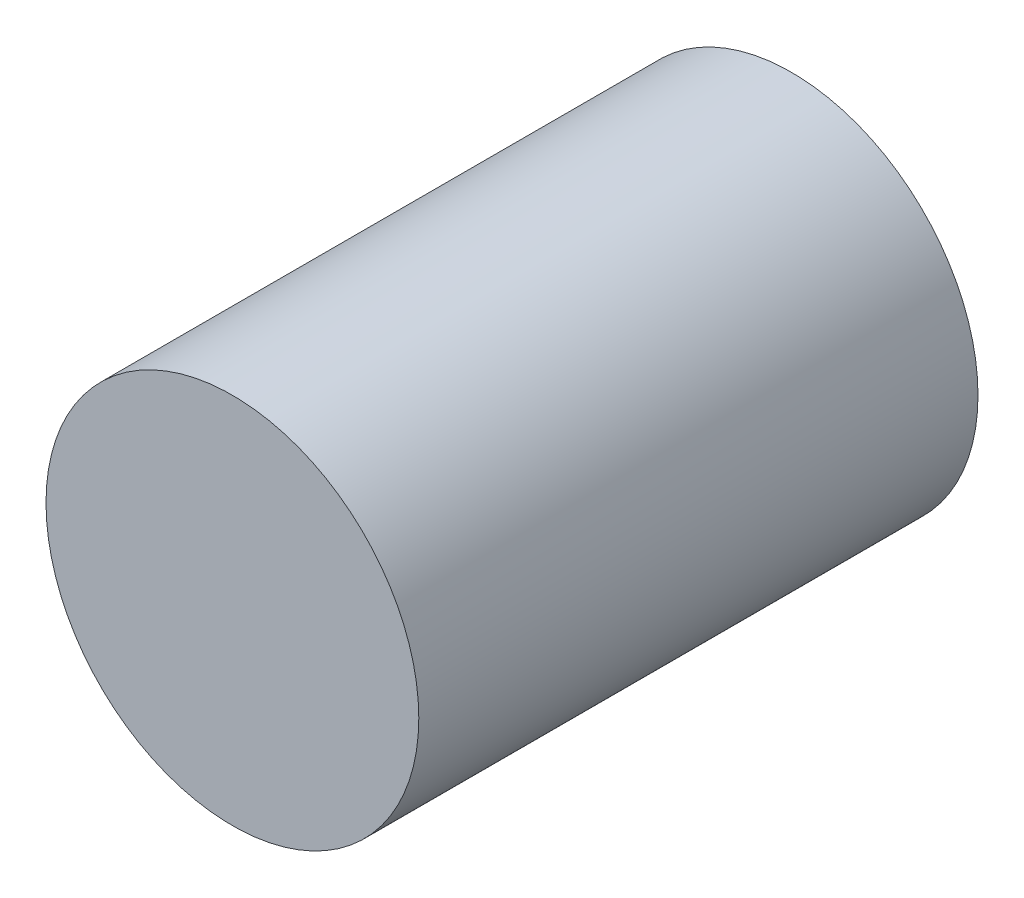
ISO-10303-21;
HEADER;
FILE_DESCRIPTION(('STEP AP214'),'2;1');
FILE_NAME('part.step','',(''),(''),'','','');
FILE_SCHEMA(('AUTOMOTIVE_DESIGN { 1 0 10303 214 1 1 1 1 }'));
ENDSEC;
DATA;
#1=APPLICATION_CONTEXT('core data for automotive mechanical design processes');
#2=APPLICATION_PROTOCOL_DEFINITION('international standard','automotive_design',2000,#1);
#3=PRODUCT_CONTEXT('',#1,'mechanical');
#4=PRODUCT('Part','Part','',(#3));
#5=PRODUCT_RELATED_PRODUCT_CATEGORY('part','',(#4));
#6=PRODUCT_DEFINITION_FORMATION('','',#4);
#7=PRODUCT_DEFINITION_CONTEXT('part definition',#1,'design');
#8=PRODUCT_DEFINITION('design','',#6,#7);
#9=PRODUCT_DEFINITION_SHAPE('','',#8);
#10=(LENGTH_UNIT() NAMED_UNIT(*) SI_UNIT(.MILLI.,.METRE.));
#11=(NAMED_UNIT(*) PLANE_ANGLE_UNIT() SI_UNIT($,.RADIAN.));
#12=(NAMED_UNIT(*) SI_UNIT($,.STERADIAN.) SOLID_ANGLE_UNIT());
#13=UNCERTAINTY_MEASURE_WITH_UNIT(LENGTH_MEASURE(1.E-05),#10,'distance_accuracy_value','');
#14=(GEOMETRIC_REPRESENTATION_CONTEXT(3) GLOBAL_UNCERTAINTY_ASSIGNED_CONTEXT((#13)) GLOBAL_UNIT_ASSIGNED_CONTEXT((#10,
#11,#12)) REPRESENTATION_CONTEXT('',''));
#15=CARTESIAN_POINT('',(0.,0.,0.));
#16=DIRECTION('',(0.,0.,1.));
#17=DIRECTION('',(1.,0.,0.));
#18=AXIS2_PLACEMENT_3D('',#15,#16,#17);
#19=CARTESIAN_POINT('',(0.,0.,12.));
#20=DIRECTION('',(0.,0.,-1.));
#21=DIRECTION('',(-1.,0.,0.));
#22=AXIS2_PLACEMENT_3D('',#19,#20,#21);
#23=CYLINDRICAL_SURFACE('',#22,4.);
#24=CARTESIAN_POINT('',(0.,0.,12.));
#25=DIRECTION('',(0.,0.,1.));
#26=DIRECTION('',(1.,0.,0.));
#27=AXIS2_PLACEMENT_3D('',#24,#25,#26);
#28=CIRCLE('',#27,4.);
#29=CARTESIAN_POINT('',(4.,0.,12.));
#30=VERTEX_POINT('',#29);
#31=EDGE_CURVE('E10',#30,#30,#28,.T.);
#32=ORIENTED_EDGE('',*,*,#31,.F.);
#33=EDGE_LOOP('',(#32));
#34=FACE_BOUND('',#33,.T.);
#35=CARTESIAN_POINT('',(0.,0.,0.));
#36=DIRECTION('',(0.,0.,1.));
#37=DIRECTION('',(1.,0.,0.));
#38=AXIS2_PLACEMENT_3D('',#35,#36,#37);
#39=CIRCLE('',#38,4.);
#40=CARTESIAN_POINT('',(4.,0.,0.));
#41=VERTEX_POINT('',#40);
#42=EDGE_CURVE('E46',#41,#41,#39,.T.);
#43=ORIENTED_EDGE('',*,*,#42,.T.);
#44=EDGE_LOOP('',(#43));
#45=FACE_BOUND('',#44,.T.);
#46=ADVANCED_FACE('F43',(#34,#45),#23,.T.);
#47=CARTESIAN_POINT('',(0.,0.,12.));
#48=DIRECTION('',(0.,0.,1.));
#49=DIRECTION('',(1.,0.,0.));
#50=AXIS2_PLACEMENT_3D('',#47,#48,#49);
#51=PLANE('',#50);
#52=ORIENTED_EDGE('',*,*,#31,.T.);
#53=EDGE_LOOP('',(#52));
#54=FACE_BOUND('',#53,.T.);
#55=ADVANCED_FACE('F60',(#54),#51,.T.);
#56=CARTESIAN_POINT('',(0.,0.,0.));
#57=DIRECTION('',(0.,0.,1.));
#58=DIRECTION('',(1.,0.,0.));
#59=AXIS2_PLACEMENT_3D('',#56,#57,#58);
#60=PLANE('',#59);
#61=ORIENTED_EDGE('',*,*,#42,.F.);
#62=EDGE_LOOP('',(#61));
#63=FACE_BOUND('',#62,.T.);
#64=ADVANCED_FACE('F58',(#63),#60,.F.);
#65=CLOSED_SHELL('',(#46,#55,#64));
#66=MANIFOLD_SOLID_BREP('B2',#65);
#67=ADVANCED_BREP_SHAPE_REPRESENTATION('',(#18,#66),#14);
#68=SHAPE_DEFINITION_REPRESENTATION(#9,#67);
ENDSEC;
END-ISO-10303-21;
